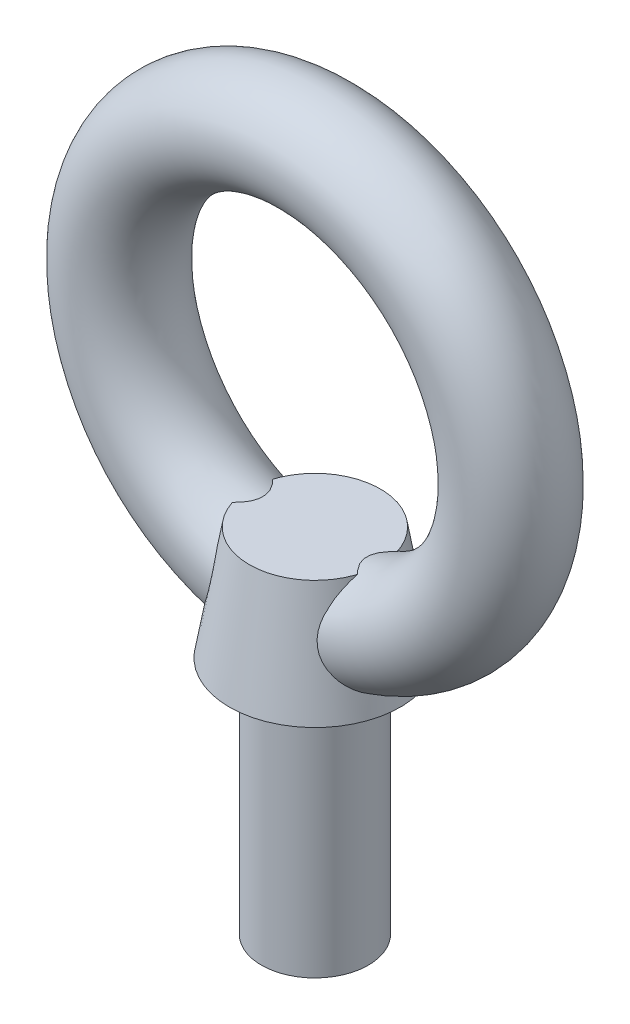
ISO-10303-21;
HEADER;
FILE_DESCRIPTION(('STEP AP214'),'2;1');
FILE_NAME('part.step','',(''),(''),'','','');
FILE_SCHEMA(('AUTOMOTIVE_DESIGN { 1 0 10303 214 1 1 1 1 }'));
ENDSEC;
DATA;
#1=APPLICATION_CONTEXT('core data for automotive mechanical design processes');
#2=APPLICATION_PROTOCOL_DEFINITION('international standard','automotive_design',2000,#1);
#3=PRODUCT_CONTEXT('',#1,'mechanical');
#4=PRODUCT('Part','Part','',(#3));
#5=PRODUCT_RELATED_PRODUCT_CATEGORY('part','',(#4));
#6=PRODUCT_DEFINITION_FORMATION('','',#4);
#7=PRODUCT_DEFINITION_CONTEXT('part definition',#1,'design');
#8=PRODUCT_DEFINITION('design','',#6,#7);
#9=PRODUCT_DEFINITION_SHAPE('','',#8);
#10=(LENGTH_UNIT() NAMED_UNIT(*) SI_UNIT(.MILLI.,.METRE.));
#11=(NAMED_UNIT(*) PLANE_ANGLE_UNIT() SI_UNIT($,.RADIAN.));
#12=(NAMED_UNIT(*) SI_UNIT($,.STERADIAN.) SOLID_ANGLE_UNIT());
#13=UNCERTAINTY_MEASURE_WITH_UNIT(LENGTH_MEASURE(1.E-05),#10,'distance_accuracy_value','');
#14=(GEOMETRIC_REPRESENTATION_CONTEXT(3) GLOBAL_UNCERTAINTY_ASSIGNED_CONTEXT((#13)) GLOBAL_UNIT_ASSIGNED_CONTEXT((#10,
#11,#12)) REPRESENTATION_CONTEXT('',''));
#15=CARTESIAN_POINT('',(0.,0.,0.));
#16=DIRECTION('',(0.,0.,1.));
#17=DIRECTION('',(1.,0.,0.));
#18=AXIS2_PLACEMENT_3D('',#15,#16,#17);
#19=CARTESIAN_POINT('',(0.,-11.6,0.));
#20=DIRECTION('',(0.,-1.,0.));
#21=DIRECTION('',(0.,0.,1.));
#22=AXIS2_PLACEMENT_3D('',#19,#20,#21);
#23=CONICAL_SURFACE('',#22,4.,0.174532925199434);
#24=CARTESIAN_POINT('',(0.,-6.3,0.));
#25=DIRECTION('',(0.,1.,0.));
#26=DIRECTION('',(0.,0.,1.));
#27=AXIS2_PLACEMENT_3D('',#24,#25,#26);
#28=CIRCLE('',#27,3.06546700224513);
#29=CARTESIAN_POINT('',(0.,-6.3,3.06546700224513));
#30=VERTEX_POINT('',#29);
#31=EDGE_CURVE('E40',#30,#30,#28,.T.);
#32=ORIENTED_EDGE('',*,*,#31,.F.);
#33=EDGE_LOOP('',(#32));
#34=FACE_BOUND('',#33,.T.);
#35=CARTESIAN_POINT('',(0.,-11.6,0.));
#36=DIRECTION('',(0.,1.,0.));
#37=DIRECTION('',(0.,0.,1.));
#38=AXIS2_PLACEMENT_3D('',#35,#36,#37);
#39=CIRCLE('',#38,4.);
#40=CARTESIAN_POINT('',(0.,-11.6,4.));
#41=VERTEX_POINT('',#40);
#42=EDGE_CURVE('E48',#41,#41,#39,.T.);
#43=ORIENTED_EDGE('',*,*,#42,.T.);
#44=EDGE_LOOP('',(#43));
#45=FACE_BOUND('',#44,.T.);
#46=ADVANCED_FACE('F37',(#34,#45),#23,.T.);
#47=CARTESIAN_POINT('',(0.,-6.3,0.));
#48=DIRECTION('',(0.,1.,0.));
#49=DIRECTION('',(0.,0.,1.));
#50=AXIS2_PLACEMENT_3D('',#47,#48,#49);
#51=PLANE('',#50);
#52=ORIENTED_EDGE('',*,*,#31,.T.);
#53=EDGE_LOOP('',(#52));
#54=FACE_BOUND('',#53,.T.);
#55=ADVANCED_FACE('F68',(#54),#51,.T.);
#56=CARTESIAN_POINT('',(0.,-11.6,0.));
#57=DIRECTION('',(0.,1.,0.));
#58=DIRECTION('',(0.,0.,1.));
#59=AXIS2_PLACEMENT_3D('',#56,#57,#58);
#60=PLANE('',#59);
#61=CARTESIAN_POINT('',(0.,-11.6,0.));
#62=DIRECTION('',(0.,-1.,0.));
#63=DIRECTION('',(0.,0.,-1.));
#64=AXIS2_PLACEMENT_3D('',#61,#62,#63);
#65=CIRCLE('',#64,2.5);
#66=CARTESIAN_POINT('',(0.,-11.6,-2.5));
#67=VERTEX_POINT('',#66);
#68=EDGE_CURVE('E11',#67,#67,#65,.T.);
#69=ORIENTED_EDGE('',*,*,#68,.F.);
#70=EDGE_LOOP('',(#69));
#71=FACE_BOUND('',#70,.T.);
#72=ORIENTED_EDGE('',*,*,#42,.F.);
#73=EDGE_LOOP('',(#72));
#74=FACE_BOUND('',#73,.T.);
#75=ADVANCED_FACE('F61',(#71,#74),#60,.F.);
#76=CARTESIAN_POINT('',(0.,-22.8,0.));
#77=DIRECTION('',(0.,1.,0.));
#78=DIRECTION('',(0.,0.,1.));
#79=AXIS2_PLACEMENT_3D('',#76,#77,#78);
#80=CYLINDRICAL_SURFACE('',#79,2.5);
#81=CARTESIAN_POINT('',(0.,-22.8,0.));
#82=DIRECTION('',(0.,-1.,0.));
#83=DIRECTION('',(0.,0.,-1.));
#84=AXIS2_PLACEMENT_3D('',#81,#82,#83);
#85=CIRCLE('',#84,2.5);
#86=CARTESIAN_POINT('',(0.,-22.8,-2.5));
#87=VERTEX_POINT('',#86);
#88=EDGE_CURVE('E50',#87,#87,#85,.T.);
#89=ORIENTED_EDGE('',*,*,#88,.F.);
#90=EDGE_LOOP('',(#89));
#91=FACE_BOUND('',#90,.T.);
#92=ORIENTED_EDGE('',*,*,#68,.T.);
#93=EDGE_LOOP('',(#92));
#94=FACE_BOUND('',#93,.T.);
#95=ADVANCED_FACE('F59',(#91,#94),#80,.T.);
#96=CARTESIAN_POINT('',(0.,-22.8,0.));
#97=DIRECTION('',(0.,-1.,0.));
#98=DIRECTION('',(0.,0.,-1.));
#99=AXIS2_PLACEMENT_3D('',#96,#97,#98);
#100=PLANE('',#99);
#101=ORIENTED_EDGE('',*,*,#88,.T.);
#102=EDGE_LOOP('',(#101));
#103=FACE_BOUND('',#102,.T.);
#104=ADVANCED_FACE('F57',(#103),#100,.T.);
#105=CLOSED_SHELL('',(#46,#55,#75,#95,#104));
#106=MANIFOLD_SOLID_BREP('B2',#105);
#107=CARTESIAN_POINT('',(0.,0.,0.));
#108=DIRECTION('',(0.,0.,1.));
#109=DIRECTION('',(1.,0.,0.));
#110=AXIS2_PLACEMENT_3D('',#107,#108,#109);
#111=TOROIDAL_SURFACE('',#110,9.155,2.4);
#112=CARTESIAN_POINT('',(11.555,0.,0.));
#113=VERTEX_POINT('',#112);
#114=VERTEX_LOOP('',#113);
#115=FACE_BOUND('',#114,.T.);
#116=ADVANCED_FACE('F108',(#115),#111,.T.);
#117=CLOSED_SHELL('',(#116));
#118=MANIFOLD_SOLID_BREP('B6',#117);
#119=ADVANCED_BREP_SHAPE_REPRESENTATION('',(#18,#106,#118),#14);
#120=SHAPE_DEFINITION_REPRESENTATION(#9,#119);
ENDSEC;
END-ISO-10303-21;
